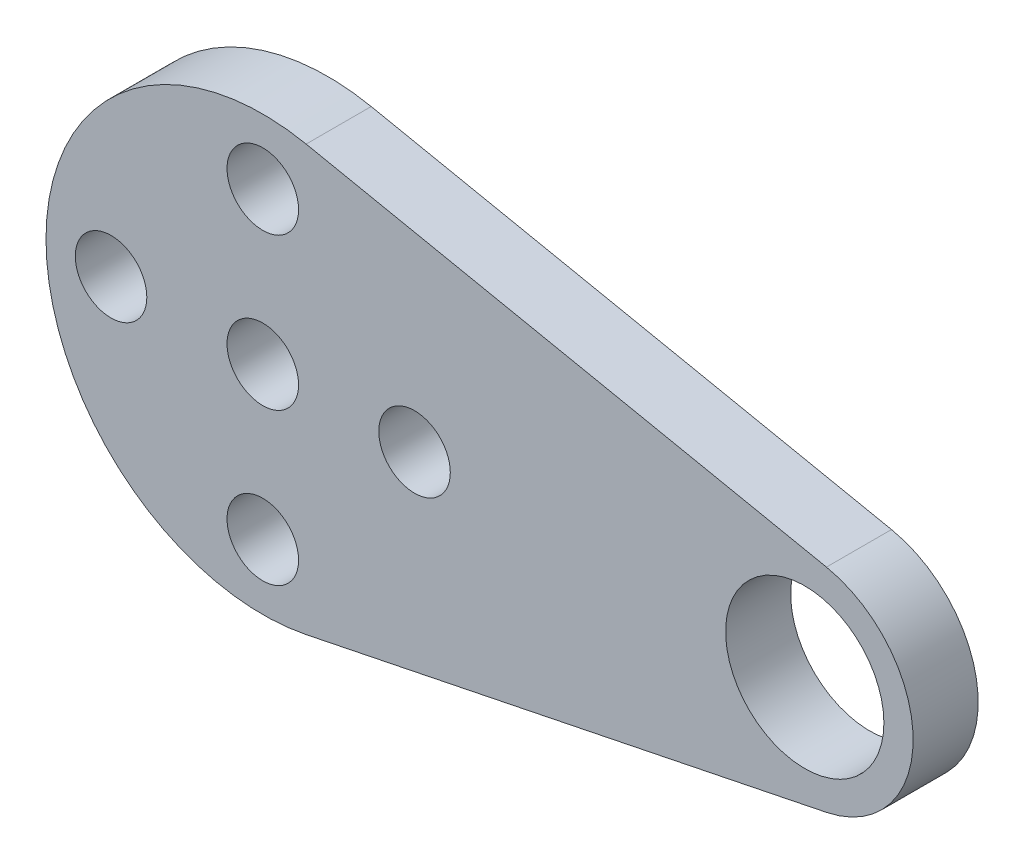
ISO-10303-21;
HEADER;
FILE_DESCRIPTION(('STEP AP214'),'2;1');
FILE_NAME('part.step','',(''),(''),'','','');
FILE_SCHEMA(('AUTOMOTIVE_DESIGN { 1 0 10303 214 1 1 1 1 }'));
ENDSEC;
DATA;
#1=APPLICATION_CONTEXT('core data for automotive mechanical design processes');
#2=APPLICATION_PROTOCOL_DEFINITION('international standard','automotive_design',2000,#1);
#3=PRODUCT_CONTEXT('',#1,'mechanical');
#4=PRODUCT('Part','Part','',(#3));
#5=PRODUCT_RELATED_PRODUCT_CATEGORY('part','',(#4));
#6=PRODUCT_DEFINITION_FORMATION('','',#4);
#7=PRODUCT_DEFINITION_CONTEXT('part definition',#1,'design');
#8=PRODUCT_DEFINITION('design','',#6,#7);
#9=PRODUCT_DEFINITION_SHAPE('','',#8);
#10=(LENGTH_UNIT() NAMED_UNIT(*) SI_UNIT(.MILLI.,.METRE.));
#11=(NAMED_UNIT(*) PLANE_ANGLE_UNIT() SI_UNIT($,.RADIAN.));
#12=(NAMED_UNIT(*) SI_UNIT($,.STERADIAN.) SOLID_ANGLE_UNIT());
#13=UNCERTAINTY_MEASURE_WITH_UNIT(LENGTH_MEASURE(1.E-05),#10,'distance_accuracy_value','');
#14=(GEOMETRIC_REPRESENTATION_CONTEXT(3) GLOBAL_UNCERTAINTY_ASSIGNED_CONTEXT((#13)) GLOBAL_UNIT_ASSIGNED_CONTEXT((#10,
#11,#12)) REPRESENTATION_CONTEXT('',''));
#15=CARTESIAN_POINT('',(0.,0.,0.));
#16=DIRECTION('',(0.,0.,1.));
#17=DIRECTION('',(1.,0.,0.));
#18=AXIS2_PLACEMENT_3D('',#15,#16,#17);
#19=CARTESIAN_POINT('',(1.42020410288673,-6.95755076535926,3.));
#20=DIRECTION('',(-0.2,0.979795897113271,0.));
#21=DIRECTION('',(-0.979795897113271,-0.2,0.));
#22=AXIS2_PLACEMENT_3D('',#19,#20,#21);
#23=PLANE('',#22);
#24=DIRECTION('',(0.979795897113271,0.2,0.));
#25=VECTOR('',#24,1.);
#26=CARTESIAN_POINT('',(1.42020410288673,-6.95755076535926,0.));
#27=LINE('',#26,#25);
#28=CARTESIAN_POINT('',(12.,-4.79795897113272,0.));
#29=VERTEX_POINT('',#28);
#30=CARTESIAN_POINT('',(36.,0.10102051443364,0.));
#31=VERTEX_POINT('',#30);
#32=EDGE_CURVE('E117',#29,#31,#27,.T.);
#33=ORIENTED_EDGE('',*,*,#32,.T.);
#34=DIRECTION('',(0.,0.,-1.));
#35=VECTOR('',#34,1.);
#36=CARTESIAN_POINT('',(36.,0.10102051443364,3.));
#37=LINE('',#36,#35);
#38=CARTESIAN_POINT('',(36.,0.10102051443364,3.));
#39=VERTEX_POINT('',#38);
#40=EDGE_CURVE('E11',#39,#31,#37,.T.);
#41=ORIENTED_EDGE('',*,*,#40,.F.);
#42=DIRECTION('',(0.979795897113271,0.2,0.));
#43=VECTOR('',#42,1.);
#44=CARTESIAN_POINT('',(1.42020410288673,-6.95755076535926,3.));
#45=LINE('',#44,#43);
#46=CARTESIAN_POINT('',(12.,-4.79795897113272,3.));
#47=VERTEX_POINT('',#46);
#48=EDGE_CURVE('E84',#47,#39,#45,.T.);
#49=ORIENTED_EDGE('',*,*,#48,.F.);
#50=DIRECTION('',(0.,0.,-1.));
#51=VECTOR('',#50,1.);
#52=CARTESIAN_POINT('',(12.,-4.79795897113272,3.));
#53=LINE('',#52,#51);
#54=EDGE_CURVE('E116',#47,#29,#53,.T.);
#55=ORIENTED_EDGE('',*,*,#54,.T.);
#56=EDGE_LOOP('',(#33,#41,#49,#55));
#57=FACE_BOUND('',#56,.T.);
#58=ADVANCED_FACE('F36',(#57),#23,.F.);
#59=CARTESIAN_POINT('',(35.,5.,3.));
#60=DIRECTION('',(0.,0.,-1.));
#61=DIRECTION('',(-1.,0.,0.));
#62=AXIS2_PLACEMENT_3D('',#59,#60,#61);
#63=CYLINDRICAL_SURFACE('',#62,5.);
#64=CARTESIAN_POINT('',(35.,5.,0.));
#65=DIRECTION('',(0.,0.,1.));
#66=DIRECTION('',(1.,0.,0.));
#67=AXIS2_PLACEMENT_3D('',#64,#65,#66);
#68=CIRCLE('',#67,5.);
#69=CARTESIAN_POINT('',(36.,9.89897948556636,0.));
#70=VERTEX_POINT('',#69);
#71=EDGE_CURVE('E89',#31,#70,#68,.T.);
#72=ORIENTED_EDGE('',*,*,#71,.T.);
#73=DIRECTION('',(0.,0.,-1.));
#74=VECTOR('',#73,1.);
#75=CARTESIAN_POINT('',(36.,9.89897948556636,3.));
#76=LINE('',#75,#74);
#77=CARTESIAN_POINT('',(36.,9.89897948556636,3.));
#78=VERTEX_POINT('',#77);
#79=EDGE_CURVE('E44',#78,#70,#76,.T.);
#80=ORIENTED_EDGE('',*,*,#79,.F.);
#81=CARTESIAN_POINT('',(35.,5.,3.));
#82=DIRECTION('',(0.,0.,1.));
#83=DIRECTION('',(1.,0.,0.));
#84=AXIS2_PLACEMENT_3D('',#81,#82,#83);
#85=CIRCLE('',#84,5.);
#86=EDGE_CURVE('E78',#39,#78,#85,.T.);
#87=ORIENTED_EDGE('',*,*,#86,.F.);
#88=ORIENTED_EDGE('',*,*,#40,.T.);
#89=EDGE_LOOP('',(#72,#80,#87,#88));
#90=FACE_BOUND('',#89,.T.);
#91=ADVANCED_FACE('F88',(#90),#63,.T.);
#92=CARTESIAN_POINT('',(3.37979589711327,16.5575507653593,3.));
#93=DIRECTION('',(0.2,0.979795897113271,0.));
#94=DIRECTION('',(-0.979795897113271,0.2,0.));
#95=AXIS2_PLACEMENT_3D('',#92,#93,#94);
#96=PLANE('',#95);
#97=DIRECTION('',(0.979795897113271,-0.2,0.));
#98=VECTOR('',#97,1.);
#99=CARTESIAN_POINT('',(3.37979589711327,16.5575507653593,0.));
#100=LINE('',#99,#98);
#101=CARTESIAN_POINT('',(12.,14.7979589711327,0.));
#102=VERTEX_POINT('',#101);
#103=EDGE_CURVE('E121',#102,#70,#100,.T.);
#104=ORIENTED_EDGE('',*,*,#103,.F.);
#105=DIRECTION('',(0.,0.,-1.));
#106=VECTOR('',#105,1.);
#107=CARTESIAN_POINT('',(12.,14.7979589711327,3.));
#108=LINE('',#107,#106);
#109=CARTESIAN_POINT('',(12.,14.7979589711327,3.));
#110=VERTEX_POINT('',#109);
#111=EDGE_CURVE('E68',#110,#102,#108,.T.);
#112=ORIENTED_EDGE('',*,*,#111,.F.);
#113=DIRECTION('',(0.979795897113271,-0.2,0.));
#114=VECTOR('',#113,1.);
#115=CARTESIAN_POINT('',(3.37979589711327,16.5575507653593,3.));
#116=LINE('',#115,#114);
#117=EDGE_CURVE('E82',#110,#78,#116,.T.);
#118=ORIENTED_EDGE('',*,*,#117,.T.);
#119=ORIENTED_EDGE('',*,*,#79,.T.);
#120=EDGE_LOOP('',(#104,#112,#118,#119));
#121=FACE_BOUND('',#120,.T.);
#122=ADVANCED_FACE('F93',(#121),#96,.T.);
#123=CARTESIAN_POINT('',(10.,-2.,3.));
#124=DIRECTION('',(0.,0.,-1.));
#125=DIRECTION('',(-1.,0.,0.));
#126=AXIS2_PLACEMENT_3D('',#123,#124,#125);
#127=CYLINDRICAL_SURFACE('',#126,1.65);
#128=CARTESIAN_POINT('',(10.,-2.,3.));
#129=DIRECTION('',(0.,0.,1.));
#130=DIRECTION('',(1.,0.,0.));
#131=AXIS2_PLACEMENT_3D('',#128,#129,#130);
#132=CIRCLE('',#131,1.65);
#133=CARTESIAN_POINT('',(11.65,-2.,3.));
#134=VERTEX_POINT('',#133);
#135=EDGE_CURVE('E110',#134,#134,#132,.F.);
#136=ORIENTED_EDGE('',*,*,#135,.F.);
#137=EDGE_LOOP('',(#136));
#138=FACE_BOUND('',#137,.T.);
#139=CARTESIAN_POINT('',(10.,-2.,0.));
#140=DIRECTION('',(0.,0.,1.));
#141=DIRECTION('',(1.,0.,0.));
#142=AXIS2_PLACEMENT_3D('',#139,#140,#141);
#143=CIRCLE('',#142,1.65);
#144=CARTESIAN_POINT('',(11.65,-2.,0.));
#145=VERTEX_POINT('',#144);
#146=EDGE_CURVE('E136',#145,#145,#143,.F.);
#147=ORIENTED_EDGE('',*,*,#146,.T.);
#148=EDGE_LOOP('',(#147));
#149=FACE_BOUND('',#148,.T.);
#150=ADVANCED_FACE('F182',(#138,#149),#127,.F.);
#151=CARTESIAN_POINT('',(10.,12.,3.));
#152=DIRECTION('',(0.,0.,-1.));
#153=DIRECTION('',(-1.,0.,0.));
#154=AXIS2_PLACEMENT_3D('',#151,#152,#153);
#155=CYLINDRICAL_SURFACE('',#154,1.65);
#156=CARTESIAN_POINT('',(10.,12.,3.));
#157=DIRECTION('',(0.,0.,1.));
#158=DIRECTION('',(1.,0.,0.));
#159=AXIS2_PLACEMENT_3D('',#156,#157,#158);
#160=CIRCLE('',#159,1.65);
#161=CARTESIAN_POINT('',(11.65,12.,3.));
#162=VERTEX_POINT('',#161);
#163=EDGE_CURVE('E107',#162,#162,#160,.T.);
#164=ORIENTED_EDGE('',*,*,#163,.T.);
#165=EDGE_LOOP('',(#164));
#166=FACE_BOUND('',#165,.T.);
#167=CARTESIAN_POINT('',(10.,12.,0.));
#168=DIRECTION('',(0.,0.,1.));
#169=DIRECTION('',(1.,0.,0.));
#170=AXIS2_PLACEMENT_3D('',#167,#168,#169);
#171=CIRCLE('',#170,1.65);
#172=CARTESIAN_POINT('',(11.65,12.,0.));
#173=VERTEX_POINT('',#172);
#174=EDGE_CURVE('E133',#173,#173,#171,.T.);
#175=ORIENTED_EDGE('',*,*,#174,.F.);
#176=EDGE_LOOP('',(#175));
#177=FACE_BOUND('',#176,.T.);
#178=ADVANCED_FACE('F195',(#166,#177),#155,.F.);
#179=CARTESIAN_POINT('',(17.,5.,3.));
#180=DIRECTION('',(0.,0.,-1.));
#181=DIRECTION('',(-1.,0.,0.));
#182=AXIS2_PLACEMENT_3D('',#179,#180,#181);
#183=CYLINDRICAL_SURFACE('',#182,1.65);
#184=CARTESIAN_POINT('',(17.,5.,3.));
#185=DIRECTION('',(0.,0.,1.));
#186=DIRECTION('',(1.,0.,0.));
#187=AXIS2_PLACEMENT_3D('',#184,#185,#186);
#188=CIRCLE('',#187,1.65);
#189=CARTESIAN_POINT('',(18.65,5.,3.));
#190=VERTEX_POINT('',#189);
#191=EDGE_CURVE('E104',#190,#190,#188,.T.);
#192=ORIENTED_EDGE('',*,*,#191,.T.);
#193=EDGE_LOOP('',(#192));
#194=FACE_BOUND('',#193,.T.);
#195=CARTESIAN_POINT('',(17.,5.,0.));
#196=DIRECTION('',(0.,0.,1.));
#197=DIRECTION('',(1.,0.,0.));
#198=AXIS2_PLACEMENT_3D('',#195,#196,#197);
#199=CIRCLE('',#198,1.65);
#200=CARTESIAN_POINT('',(18.65,5.,0.));
#201=VERTEX_POINT('',#200);
#202=EDGE_CURVE('E130',#201,#201,#199,.T.);
#203=ORIENTED_EDGE('',*,*,#202,.F.);
#204=EDGE_LOOP('',(#203));
#205=FACE_BOUND('',#204,.T.);
#206=ADVANCED_FACE('F191',(#194,#205),#183,.F.);
#207=CARTESIAN_POINT('',(3.,5.,3.));
#208=DIRECTION('',(0.,0.,-1.));
#209=DIRECTION('',(-1.,0.,0.));
#210=AXIS2_PLACEMENT_3D('',#207,#208,#209);
#211=CYLINDRICAL_SURFACE('',#210,1.65);
#212=CARTESIAN_POINT('',(3.,5.,3.));
#213=DIRECTION('',(0.,0.,1.));
#214=DIRECTION('',(1.,0.,0.));
#215=AXIS2_PLACEMENT_3D('',#212,#213,#214);
#216=CIRCLE('',#215,1.65);
#217=CARTESIAN_POINT('',(4.65,5.,3.));
#218=VERTEX_POINT('',#217);
#219=EDGE_CURVE('E101',#218,#218,#216,.F.);
#220=ORIENTED_EDGE('',*,*,#219,.F.);
#221=EDGE_LOOP('',(#220));
#222=FACE_BOUND('',#221,.T.);
#223=CARTESIAN_POINT('',(3.,5.,0.));
#224=DIRECTION('',(0.,0.,1.));
#225=DIRECTION('',(1.,0.,0.));
#226=AXIS2_PLACEMENT_3D('',#223,#224,#225);
#227=CIRCLE('',#226,1.65);
#228=CARTESIAN_POINT('',(4.65,5.,0.));
#229=VERTEX_POINT('',#228);
#230=EDGE_CURVE('E127',#229,#229,#227,.F.);
#231=ORIENTED_EDGE('',*,*,#230,.T.);
#232=EDGE_LOOP('',(#231));
#233=FACE_BOUND('',#232,.T.);
#234=ADVANCED_FACE('F187',(#222,#233),#211,.F.);
#235=CARTESIAN_POINT('',(10.,5.,3.));
#236=DIRECTION('',(0.,0.,-1.));
#237=DIRECTION('',(-1.,0.,0.));
#238=AXIS2_PLACEMENT_3D('',#235,#236,#237);
#239=CYLINDRICAL_SURFACE('',#238,1.65);
#240=CARTESIAN_POINT('',(10.,5.,3.));
#241=DIRECTION('',(0.,0.,1.));
#242=DIRECTION('',(1.,0.,0.));
#243=AXIS2_PLACEMENT_3D('',#240,#241,#242);
#244=CIRCLE('',#243,1.65);
#245=CARTESIAN_POINT('',(11.65,5.,3.));
#246=VERTEX_POINT('',#245);
#247=EDGE_CURVE('E95',#246,#246,#244,.T.);
#248=ORIENTED_EDGE('',*,*,#247,.T.);
#249=EDGE_LOOP('',(#248));
#250=FACE_BOUND('',#249,.T.);
#251=CARTESIAN_POINT('',(10.,5.,0.));
#252=DIRECTION('',(0.,0.,1.));
#253=DIRECTION('',(1.,0.,0.));
#254=AXIS2_PLACEMENT_3D('',#251,#252,#253);
#255=CIRCLE('',#254,1.65);
#256=CARTESIAN_POINT('',(11.65,5.,0.));
#257=VERTEX_POINT('',#256);
#258=EDGE_CURVE('E124',#257,#257,#255,.T.);
#259=ORIENTED_EDGE('',*,*,#258,.F.);
#260=EDGE_LOOP('',(#259));
#261=FACE_BOUND('',#260,.T.);
#262=ADVANCED_FACE('F172',(#250,#261),#239,.F.);
#263=CARTESIAN_POINT('',(10.,5.,3.));
#264=DIRECTION('',(0.,0.,-1.));
#265=DIRECTION('',(-1.,0.,0.));
#266=AXIS2_PLACEMENT_3D('',#263,#264,#265);
#267=CYLINDRICAL_SURFACE('',#266,10.);
#268=CARTESIAN_POINT('',(10.,5.,0.));
#269=DIRECTION('',(0.,0.,1.));
#270=DIRECTION('',(1.,0.,0.));
#271=AXIS2_PLACEMENT_3D('',#268,#269,#270);
#272=CIRCLE('',#271,10.);
#273=EDGE_CURVE('E71',#102,#29,#272,.T.);
#274=ORIENTED_EDGE('',*,*,#273,.T.);
#275=ORIENTED_EDGE('',*,*,#54,.F.);
#276=CARTESIAN_POINT('',(10.,5.,3.));
#277=DIRECTION('',(0.,0.,1.));
#278=DIRECTION('',(1.,0.,0.));
#279=AXIS2_PLACEMENT_3D('',#276,#277,#278);
#280=CIRCLE('',#279,10.);
#281=EDGE_CURVE('E52',#110,#47,#280,.T.);
#282=ORIENTED_EDGE('',*,*,#281,.F.);
#283=ORIENTED_EDGE('',*,*,#111,.T.);
#284=EDGE_LOOP('',(#274,#275,#282,#283));
#285=FACE_BOUND('',#284,.T.);
#286=ADVANCED_FACE('F164',(#285),#267,.T.);
#287=CARTESIAN_POINT('',(35.,5.,3.));
#288=DIRECTION('',(0.,0.,-1.));
#289=DIRECTION('',(-1.,0.,0.));
#290=AXIS2_PLACEMENT_3D('',#287,#288,#289);
#291=CYLINDRICAL_SURFACE('',#290,3.65);
#292=CARTESIAN_POINT('',(35.,5.,3.));
#293=DIRECTION('',(0.,0.,1.));
#294=DIRECTION('',(1.,0.,0.));
#295=AXIS2_PLACEMENT_3D('',#292,#293,#294);
#296=CIRCLE('',#295,3.65);
#297=CARTESIAN_POINT('',(38.65,5.,3.));
#298=VERTEX_POINT('',#297);
#299=EDGE_CURVE('E113',#298,#298,#296,.T.);
#300=ORIENTED_EDGE('',*,*,#299,.T.);
#301=EDGE_LOOP('',(#300));
#302=FACE_BOUND('',#301,.T.);
#303=CARTESIAN_POINT('',(35.,5.,0.));
#304=DIRECTION('',(0.,0.,1.));
#305=DIRECTION('',(1.,0.,0.));
#306=AXIS2_PLACEMENT_3D('',#303,#304,#305);
#307=CIRCLE('',#306,3.65);
#308=CARTESIAN_POINT('',(38.65,5.,0.));
#309=VERTEX_POINT('',#308);
#310=EDGE_CURVE('E139',#309,#309,#307,.T.);
#311=ORIENTED_EDGE('',*,*,#310,.F.);
#312=EDGE_LOOP('',(#311));
#313=FACE_BOUND('',#312,.T.);
#314=ADVANCED_FACE('F162',(#302,#313),#291,.F.);
#315=CARTESIAN_POINT('',(0.,0.,3.));
#316=DIRECTION('',(0.,0.,1.));
#317=DIRECTION('',(1.,0.,0.));
#318=AXIS2_PLACEMENT_3D('',#315,#316,#317);
#319=PLANE('',#318);
#320=ORIENTED_EDGE('',*,*,#48,.T.);
#321=ORIENTED_EDGE('',*,*,#86,.T.);
#322=ORIENTED_EDGE('',*,*,#117,.F.);
#323=ORIENTED_EDGE('',*,*,#281,.T.);
#324=EDGE_LOOP('',(#320,#321,#322,#323));
#325=FACE_BOUND('',#324,.T.);
#326=ORIENTED_EDGE('',*,*,#247,.F.);
#327=EDGE_LOOP('',(#326));
#328=FACE_BOUND('',#327,.T.);
#329=ORIENTED_EDGE('',*,*,#219,.T.);
#330=EDGE_LOOP('',(#329));
#331=FACE_BOUND('',#330,.T.);
#332=ORIENTED_EDGE('',*,*,#191,.F.);
#333=EDGE_LOOP('',(#332));
#334=FACE_BOUND('',#333,.T.);
#335=ORIENTED_EDGE('',*,*,#163,.F.);
#336=EDGE_LOOP('',(#335));
#337=FACE_BOUND('',#336,.T.);
#338=ORIENTED_EDGE('',*,*,#135,.T.);
#339=EDGE_LOOP('',(#338));
#340=FACE_BOUND('',#339,.T.);
#341=ORIENTED_EDGE('',*,*,#299,.F.);
#342=EDGE_LOOP('',(#341));
#343=FACE_BOUND('',#342,.T.);
#344=ADVANCED_FACE('F79',(#325,#328,#331,#334,#337,#340,#343),#319,.T.);
#345=CARTESIAN_POINT('',(0.,0.,0.));
#346=DIRECTION('',(0.,0.,1.));
#347=DIRECTION('',(1.,0.,0.));
#348=AXIS2_PLACEMENT_3D('',#345,#346,#347);
#349=PLANE('',#348);
#350=ORIENTED_EDGE('',*,*,#32,.F.);
#351=ORIENTED_EDGE('',*,*,#273,.F.);
#352=ORIENTED_EDGE('',*,*,#103,.T.);
#353=ORIENTED_EDGE('',*,*,#71,.F.);
#354=EDGE_LOOP('',(#350,#351,#352,#353));
#355=FACE_BOUND('',#354,.T.);
#356=ORIENTED_EDGE('',*,*,#258,.T.);
#357=EDGE_LOOP('',(#356));
#358=FACE_BOUND('',#357,.T.);
#359=ORIENTED_EDGE('',*,*,#230,.F.);
#360=EDGE_LOOP('',(#359));
#361=FACE_BOUND('',#360,.T.);
#362=ORIENTED_EDGE('',*,*,#202,.T.);
#363=EDGE_LOOP('',(#362));
#364=FACE_BOUND('',#363,.T.);
#365=ORIENTED_EDGE('',*,*,#174,.T.);
#366=EDGE_LOOP('',(#365));
#367=FACE_BOUND('',#366,.T.);
#368=ORIENTED_EDGE('',*,*,#146,.F.);
#369=EDGE_LOOP('',(#368));
#370=FACE_BOUND('',#369,.T.);
#371=ORIENTED_EDGE('',*,*,#310,.T.);
#372=EDGE_LOOP('',(#371));
#373=FACE_BOUND('',#372,.T.);
#374=ADVANCED_FACE('F146',(#355,#358,#361,#364,#367,#370,#373),#349,.F.);
#375=CLOSED_SHELL('',(#58,#91,#122,#150,#178,#206,#234,#262,#286,#314,#344,#374));
#376=MANIFOLD_SOLID_BREP('B2',#375);
#377=ADVANCED_BREP_SHAPE_REPRESENTATION('',(#18,#376),#14);
#378=SHAPE_DEFINITION_REPRESENTATION(#9,#377);
ENDSEC;
END-ISO-10303-21;
